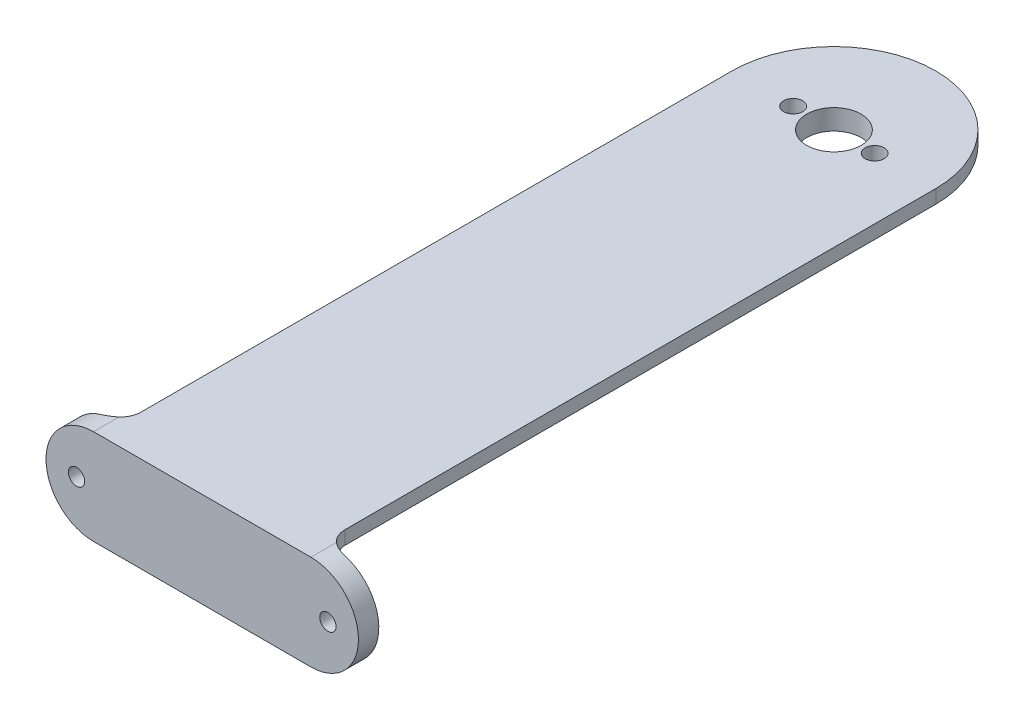
ISO-10303-21;
HEADER;
FILE_DESCRIPTION(('STEP AP214'),'2;1');
FILE_NAME('part.step','',(''),(''),'','','');
FILE_SCHEMA(('AUTOMOTIVE_DESIGN { 1 0 10303 214 1 1 1 1 }'));
ENDSEC;
DATA;
#1=APPLICATION_CONTEXT('core data for automotive mechanical design processes');
#2=APPLICATION_PROTOCOL_DEFINITION('international standard','automotive_design',2000,#1);
#3=PRODUCT_CONTEXT('',#1,'mechanical');
#4=PRODUCT('Part','Part','',(#3));
#5=PRODUCT_RELATED_PRODUCT_CATEGORY('part','',(#4));
#6=PRODUCT_DEFINITION_FORMATION('','',#4);
#7=PRODUCT_DEFINITION_CONTEXT('part definition',#1,'design');
#8=PRODUCT_DEFINITION('design','',#6,#7);
#9=PRODUCT_DEFINITION_SHAPE('','',#8);
#10=(LENGTH_UNIT() NAMED_UNIT(*) SI_UNIT(.MILLI.,.METRE.));
#11=(NAMED_UNIT(*) PLANE_ANGLE_UNIT() SI_UNIT($,.RADIAN.));
#12=(NAMED_UNIT(*) SI_UNIT($,.STERADIAN.) SOLID_ANGLE_UNIT());
#13=UNCERTAINTY_MEASURE_WITH_UNIT(LENGTH_MEASURE(1.E-05),#10,'distance_accuracy_value','');
#14=(GEOMETRIC_REPRESENTATION_CONTEXT(3) GLOBAL_UNCERTAINTY_ASSIGNED_CONTEXT((#13)) GLOBAL_UNIT_ASSIGNED_CONTEXT((#10,
#11,#12)) REPRESENTATION_CONTEXT('',''));
#15=CARTESIAN_POINT('',(0.,0.,0.));
#16=DIRECTION('',(0.,0.,1.));
#17=DIRECTION('',(1.,0.,0.));
#18=AXIS2_PLACEMENT_3D('',#15,#16,#17);
#19=CARTESIAN_POINT('',(0.,0.,0.));
#20=DIRECTION('',(0.,1.,0.));
#21=DIRECTION('',(0.,0.,1.));
#22=AXIS2_PLACEMENT_3D('',#19,#20,#21);
#23=PLANE('',#22);
#24=CARTESIAN_POINT('',(0.,0.,0.));
#25=DIRECTION('',(0.,1.,0.));
#26=DIRECTION('',(0.,0.,1.));
#27=AXIS2_PLACEMENT_3D('',#24,#25,#26);
#28=CIRCLE('',#27,7.75);
#29=CARTESIAN_POINT('',(0.,0.,7.75));
#30=VERTEX_POINT('',#29);
#31=EDGE_CURVE('E174',#30,#30,#28,.F.);
#32=ORIENTED_EDGE('',*,*,#31,.F.);
#33=EDGE_LOOP('',(#32));
#34=FACE_BOUND('',#33,.T.);
#35=DIRECTION('',(0.,0.,-1.));
#36=VECTOR('',#35,1.);
#37=CARTESIAN_POINT('',(15.,0.,90.));
#38=LINE('',#37,#36);
#39=CARTESIAN_POINT('',(15.,0.,87.));
#40=VERTEX_POINT('',#39);
#41=CARTESIAN_POINT('',(15.,0.,0.));
#42=VERTEX_POINT('',#41);
#43=EDGE_CURVE('E160',#40,#42,#38,.T.);
#44=ORIENTED_EDGE('',*,*,#43,.F.);
#45=DIRECTION('',(1.,0.,0.));
#46=VECTOR('',#45,1.);
#47=CARTESIAN_POINT('',(-15.,0.,87.));
#48=LINE('',#47,#46);
#49=CARTESIAN_POINT('',(-15.,0.,87.));
#50=VERTEX_POINT('',#49);
#51=EDGE_CURVE('E206',#40,#50,#48,.F.);
#52=ORIENTED_EDGE('',*,*,#51,.T.);
#53=DIRECTION('',(0.,0.,1.));
#54=VECTOR('',#53,1.);
#55=CARTESIAN_POINT('',(-15.,0.,0.));
#56=LINE('',#55,#54);
#57=CARTESIAN_POINT('',(-15.,0.,0.));
#58=VERTEX_POINT('',#57);
#59=EDGE_CURVE('E163',#58,#50,#56,.T.);
#60=ORIENTED_EDGE('',*,*,#59,.F.);
#61=CARTESIAN_POINT('',(0.,0.,0.));
#62=DIRECTION('',(0.,1.,0.));
#63=DIRECTION('',(0.,0.,1.));
#64=AXIS2_PLACEMENT_3D('',#61,#62,#63);
#65=CIRCLE('',#64,15.);
#66=EDGE_CURVE('E155',#42,#58,#65,.T.);
#67=ORIENTED_EDGE('',*,*,#66,.F.);
#68=EDGE_LOOP('',(#44,#52,#60,#67));
#69=FACE_BOUND('',#68,.T.);
#70=CARTESIAN_POINT('',(0.,0.,65.));
#71=DIRECTION('',(0.,1.,0.));
#72=DIRECTION('',(0.,0.,1.));
#73=AXIS2_PLACEMENT_3D('',#70,#71,#72);
#74=CIRCLE('',#73,3.75);
#75=CARTESIAN_POINT('',(0.,0.,68.75));
#76=VERTEX_POINT('',#75);
#77=EDGE_CURVE('E177',#76,#76,#74,.F.);
#78=ORIENTED_EDGE('',*,*,#77,.F.);
#79=EDGE_LOOP('',(#78));
#80=FACE_BOUND('',#79,.T.);
#81=ADVANCED_FACE('F32',(#34,#69,#80),#23,.F.);
#82=CARTESIAN_POINT('',(0.,2.,0.));
#83=DIRECTION('',(0.,1.,0.));
#84=DIRECTION('',(0.,0.,1.));
#85=AXIS2_PLACEMENT_3D('',#82,#83,#84);
#86=PLANE('',#85);
#87=CARTESIAN_POINT('',(-6.,2.,0.));
#88=DIRECTION('',(0.,1.,0.));
#89=DIRECTION('',(0.,0.,1.));
#90=AXIS2_PLACEMENT_3D('',#87,#88,#89);
#91=CIRCLE('',#90,1.4);
#92=CARTESIAN_POINT('',(-6.,2.,1.4));
#93=VERTEX_POINT('',#92);
#94=EDGE_CURVE('E134',#93,#93,#91,.T.);
#95=ORIENTED_EDGE('',*,*,#94,.F.);
#96=EDGE_LOOP('',(#95));
#97=FACE_BOUND('',#96,.T.);
#98=CARTESIAN_POINT('',(6.,2.,0.));
#99=DIRECTION('',(0.,1.,0.));
#100=DIRECTION('',(0.,0.,1.));
#101=AXIS2_PLACEMENT_3D('',#98,#99,#100);
#102=CIRCLE('',#101,1.4);
#103=CARTESIAN_POINT('',(6.,2.,1.4));
#104=VERTEX_POINT('',#103);
#105=EDGE_CURVE('E142',#104,#104,#102,.T.);
#106=ORIENTED_EDGE('',*,*,#105,.F.);
#107=EDGE_LOOP('',(#106));
#108=FACE_BOUND('',#107,.T.);
#109=CARTESIAN_POINT('',(0.,2.,0.));
#110=DIRECTION('',(0.,1.,0.));
#111=DIRECTION('',(0.,0.,1.));
#112=AXIS2_PLACEMENT_3D('',#109,#110,#111);
#113=CIRCLE('',#112,15.);
#114=CARTESIAN_POINT('',(15.,2.,0.));
#115=VERTEX_POINT('',#114);
#116=CARTESIAN_POINT('',(-15.,2.,0.));
#117=VERTEX_POINT('',#116);
#118=EDGE_CURVE('E156',#115,#117,#113,.T.);
#119=ORIENTED_EDGE('',*,*,#118,.T.);
#120=DIRECTION('',(0.,0.,1.));
#121=VECTOR('',#120,1.);
#122=CARTESIAN_POINT('',(-15.,2.,0.));
#123=LINE('',#122,#121);
#124=CARTESIAN_POINT('',(-15.,2.,87.));
#125=VERTEX_POINT('',#124);
#126=EDGE_CURVE('E159',#117,#125,#123,.T.);
#127=ORIENTED_EDGE('',*,*,#126,.T.);
#128=CARTESIAN_POINT('',(-18.,2.,87.));
#129=DIRECTION('',(0.,1.,0.));
#130=DIRECTION('',(0.,0.,1.));
#131=AXIS2_PLACEMENT_3D('',#128,#129,#130);
#132=CIRCLE('',#131,3.);
#133=CARTESIAN_POINT('',(-16.,2.,89.2360679774998));
#134=VERTEX_POINT('',#133);
#135=EDGE_CURVE('E42',#125,#134,#132,.F.);
#136=ORIENTED_EDGE('',*,*,#135,.T.);
#137=DIRECTION('',(0.,0.,-1.));
#138=VECTOR('',#137,1.);
#139=CARTESIAN_POINT('',(-16.,2.,93.));
#140=LINE('',#139,#138);
#141=CARTESIAN_POINT('',(-16.,2.,93.));
#142=VERTEX_POINT('',#141);
#143=EDGE_CURVE('E49',#142,#134,#140,.T.);
#144=ORIENTED_EDGE('',*,*,#143,.F.);
#145=DIRECTION('',(-1.,0.,0.));
#146=VECTOR('',#145,1.);
#147=CARTESIAN_POINT('',(-16.,2.,93.));
#148=LINE('',#147,#146);
#149=CARTESIAN_POINT('',(16.,2.,93.));
#150=VERTEX_POINT('',#149);
#151=EDGE_CURVE('E127',#150,#142,#148,.T.);
#152=ORIENTED_EDGE('',*,*,#151,.F.);
#153=DIRECTION('',(0.,0.,-1.));
#154=VECTOR('',#153,1.);
#155=CARTESIAN_POINT('',(16.,2.,93.));
#156=LINE('',#155,#154);
#157=CARTESIAN_POINT('',(16.,2.,89.2360679774998));
#158=VERTEX_POINT('',#157);
#159=EDGE_CURVE('E57',#150,#158,#156,.T.);
#160=ORIENTED_EDGE('',*,*,#159,.T.);
#161=CARTESIAN_POINT('',(18.,2.,87.));
#162=DIRECTION('',(0.,1.,0.));
#163=DIRECTION('',(0.,0.,1.));
#164=AXIS2_PLACEMENT_3D('',#161,#162,#163);
#165=CIRCLE('',#164,3.);
#166=CARTESIAN_POINT('',(15.,2.,87.));
#167=VERTEX_POINT('',#166);
#168=EDGE_CURVE('E217',#158,#167,#165,.F.);
#169=ORIENTED_EDGE('',*,*,#168,.T.);
#170=DIRECTION('',(0.,0.,-1.));
#171=VECTOR('',#170,1.);
#172=CARTESIAN_POINT('',(15.,2.,90.));
#173=LINE('',#172,#171);
#174=EDGE_CURVE('E171',#167,#115,#173,.T.);
#175=ORIENTED_EDGE('',*,*,#174,.T.);
#176=EDGE_LOOP('',(#119,#127,#136,#144,#152,#160,#169,#175));
#177=FACE_BOUND('',#176,.T.);
#178=CARTESIAN_POINT('',(0.,2.,0.));
#179=DIRECTION('',(0.,1.,0.));
#180=DIRECTION('',(0.,0.,1.));
#181=AXIS2_PLACEMENT_3D('',#178,#179,#180);
#182=CIRCLE('',#181,4.);
#183=CARTESIAN_POINT('',(0.,2.,4.));
#184=VERTEX_POINT('',#183);
#185=EDGE_CURVE('E152',#184,#184,#182,.T.);
#186=ORIENTED_EDGE('',*,*,#185,.F.);
#187=EDGE_LOOP('',(#186));
#188=FACE_BOUND('',#187,.T.);
#189=ADVANCED_FACE('F240',(#97,#108,#177,#188),#86,.T.);
#190=CARTESIAN_POINT('',(0.,2.,0.));
#191=DIRECTION('',(0.,-1.,0.));
#192=DIRECTION('',(0.,0.,-1.));
#193=AXIS2_PLACEMENT_3D('',#190,#191,#192);
#194=CYLINDRICAL_SURFACE('',#193,15.);
#195=ORIENTED_EDGE('',*,*,#66,.T.);
#196=DIRECTION('',(0.,-1.,0.));
#197=VECTOR('',#196,1.);
#198=CARTESIAN_POINT('',(-15.,2.,0.));
#199=LINE('',#198,#197);
#200=EDGE_CURVE('E170',#117,#58,#199,.T.);
#201=ORIENTED_EDGE('',*,*,#200,.F.);
#202=ORIENTED_EDGE('',*,*,#118,.F.);
#203=DIRECTION('',(0.,-1.,0.));
#204=VECTOR('',#203,1.);
#205=CARTESIAN_POINT('',(15.,2.,0.));
#206=LINE('',#205,#204);
#207=EDGE_CURVE('E167',#115,#42,#206,.T.);
#208=ORIENTED_EDGE('',*,*,#207,.T.);
#209=EDGE_LOOP('',(#195,#201,#202,#208));
#210=FACE_BOUND('',#209,.T.);
#211=ADVANCED_FACE('F246',(#210),#194,.T.);
#212=CARTESIAN_POINT('',(-15.,2.,0.));
#213=DIRECTION('',(1.,0.,0.));
#214=DIRECTION('',(0.,0.,-1.));
#215=AXIS2_PLACEMENT_3D('',#212,#213,#214);
#216=PLANE('',#215);
#217=ORIENTED_EDGE('',*,*,#59,.T.);
#218=DIRECTION('',(0.,-1.,0.));
#219=VECTOR('',#218,1.);
#220=CARTESIAN_POINT('',(-15.,2.,87.));
#221=LINE('',#220,#219);
#222=EDGE_CURVE('E208',#50,#125,#221,.F.);
#223=ORIENTED_EDGE('',*,*,#222,.T.);
#224=ORIENTED_EDGE('',*,*,#126,.F.);
#225=ORIENTED_EDGE('',*,*,#200,.T.);
#226=EDGE_LOOP('',(#217,#223,#224,#225));
#227=FACE_BOUND('',#226,.T.);
#228=ADVANCED_FACE('F257',(#227),#216,.F.);
#229=CARTESIAN_POINT('',(15.,2.,90.));
#230=DIRECTION('',(-1.,0.,0.));
#231=DIRECTION('',(0.,0.,1.));
#232=AXIS2_PLACEMENT_3D('',#229,#230,#231);
#233=PLANE('',#232);
#234=ORIENTED_EDGE('',*,*,#174,.F.);
#235=DIRECTION('',(0.,-1.,0.));
#236=VECTOR('',#235,1.);
#237=CARTESIAN_POINT('',(15.,0.,87.));
#238=LINE('',#237,#236);
#239=EDGE_CURVE('E186',#167,#40,#238,.T.);
#240=ORIENTED_EDGE('',*,*,#239,.T.);
#241=ORIENTED_EDGE('',*,*,#43,.T.);
#242=ORIENTED_EDGE('',*,*,#207,.F.);
#243=EDGE_LOOP('',(#234,#240,#241,#242));
#244=FACE_BOUND('',#243,.T.);
#245=ADVANCED_FACE('F253',(#244),#233,.F.);
#246=CARTESIAN_POINT('',(0.,2.,0.));
#247=DIRECTION('',(0.,-1.,0.));
#248=DIRECTION('',(0.,0.,-1.));
#249=AXIS2_PLACEMENT_3D('',#246,#247,#248);
#250=CYLINDRICAL_SURFACE('',#249,4.);
#251=ORIENTED_EDGE('',*,*,#185,.T.);
#252=EDGE_LOOP('',(#251));
#253=FACE_BOUND('',#252,.T.);
#254=CARTESIAN_POINT('',(0.,-1.,0.));
#255=DIRECTION('',(0.,-1.,0.));
#256=DIRECTION('',(0.,0.,-1.));
#257=AXIS2_PLACEMENT_3D('',#254,#255,#256);
#258=CIRCLE('',#257,4.);
#259=CARTESIAN_POINT('',(0.,-1.,-4.));
#260=VERTEX_POINT('',#259);
#261=EDGE_CURVE('E146',#260,#260,#258,.T.);
#262=ORIENTED_EDGE('',*,*,#261,.T.);
#263=EDGE_LOOP('',(#262));
#264=FACE_BOUND('',#263,.T.);
#265=ADVANCED_FACE('F256',(#253,#264),#250,.F.);
#266=CARTESIAN_POINT('',(0.,-1.,0.));
#267=DIRECTION('',(0.,-1.,0.));
#268=DIRECTION('',(0.,0.,-1.));
#269=AXIS2_PLACEMENT_3D('',#266,#267,#268);
#270=PLANE('',#269);
#271=CARTESIAN_POINT('',(-6.,-1.,0.));
#272=DIRECTION('',(0.,-1.,0.));
#273=DIRECTION('',(0.,0.,-1.));
#274=AXIS2_PLACEMENT_3D('',#271,#272,#273);
#275=CIRCLE('',#274,1.4);
#276=CARTESIAN_POINT('',(-6.,-1.,-1.4));
#277=VERTEX_POINT('',#276);
#278=EDGE_CURVE('E137',#277,#277,#275,.T.);
#279=ORIENTED_EDGE('',*,*,#278,.F.);
#280=EDGE_LOOP('',(#279));
#281=FACE_BOUND('',#280,.T.);
#282=CARTESIAN_POINT('',(6.,-1.,0.));
#283=DIRECTION('',(0.,-1.,0.));
#284=DIRECTION('',(0.,0.,-1.));
#285=AXIS2_PLACEMENT_3D('',#282,#283,#284);
#286=CIRCLE('',#285,1.4);
#287=CARTESIAN_POINT('',(6.,-1.,-1.4));
#288=VERTEX_POINT('',#287);
#289=EDGE_CURVE('E145',#288,#288,#286,.T.);
#290=ORIENTED_EDGE('',*,*,#289,.F.);
#291=EDGE_LOOP('',(#290));
#292=FACE_BOUND('',#291,.T.);
#293=CARTESIAN_POINT('',(0.,-1.,0.));
#294=DIRECTION('',(0.,-1.,0.));
#295=DIRECTION('',(0.,0.,-1.));
#296=AXIS2_PLACEMENT_3D('',#293,#294,#295);
#297=CIRCLE('',#296,7.75);
#298=CARTESIAN_POINT('',(0.,-1.,-7.75));
#299=VERTEX_POINT('',#298);
#300=EDGE_CURVE('E149',#299,#299,#297,.T.);
#301=ORIENTED_EDGE('',*,*,#300,.T.);
#302=EDGE_LOOP('',(#301));
#303=FACE_BOUND('',#302,.T.);
#304=ORIENTED_EDGE('',*,*,#261,.F.);
#305=EDGE_LOOP('',(#304));
#306=FACE_BOUND('',#305,.T.);
#307=ADVANCED_FACE('F337',(#281,#292,#303,#306),#270,.T.);
#308=CARTESIAN_POINT('',(0.,-1.,0.));
#309=DIRECTION('',(0.,1.,0.));
#310=DIRECTION('',(0.,0.,1.));
#311=AXIS2_PLACEMENT_3D('',#308,#309,#310);
#312=CYLINDRICAL_SURFACE('',#311,7.75);
#313=ORIENTED_EDGE('',*,*,#300,.F.);
#314=EDGE_LOOP('',(#313));
#315=FACE_BOUND('',#314,.T.);
#316=ORIENTED_EDGE('',*,*,#31,.T.);
#317=EDGE_LOOP('',(#316));
#318=FACE_BOUND('',#317,.T.);
#319=ADVANCED_FACE('F335',(#315,#318),#312,.T.);
#320=CARTESIAN_POINT('',(0.,-3.,65.));
#321=DIRECTION('',(0.,1.,0.));
#322=DIRECTION('',(0.,0.,1.));
#323=AXIS2_PLACEMENT_3D('',#320,#321,#322);
#324=CYLINDRICAL_SURFACE('',#323,3.75);
#325=CARTESIAN_POINT('',(0.,-2.,65.));
#326=DIRECTION('',(0.,-1.,0.));
#327=DIRECTION('',(0.,0.,-1.));
#328=AXIS2_PLACEMENT_3D('',#325,#326,#327);
#329=CIRCLE('',#328,3.75);
#330=CARTESIAN_POINT('',(0.,-2.,61.25));
#331=VERTEX_POINT('',#330);
#332=EDGE_CURVE('E183',#331,#331,#329,.F.);
#333=ORIENTED_EDGE('',*,*,#332,.T.);
#334=EDGE_LOOP('',(#333));
#335=FACE_BOUND('',#334,.T.);
#336=ORIENTED_EDGE('',*,*,#77,.T.);
#337=EDGE_LOOP('',(#336));
#338=FACE_BOUND('',#337,.T.);
#339=ADVANCED_FACE('F331',(#335,#338),#324,.T.);
#340=CARTESIAN_POINT('',(0.,-3.,65.));
#341=DIRECTION('',(0.,-1.,0.));
#342=DIRECTION('',(0.,0.,-1.));
#343=AXIS2_PLACEMENT_3D('',#340,#341,#342);
#344=PLANE('',#343);
#345=CARTESIAN_POINT('',(0.,-3.,65.));
#346=DIRECTION('',(0.,-1.,0.));
#347=DIRECTION('',(0.,0.,-1.));
#348=AXIS2_PLACEMENT_3D('',#345,#346,#347);
#349=CIRCLE('',#348,2.75);
#350=CARTESIAN_POINT('',(0.,-3.,62.25));
#351=VERTEX_POINT('',#350);
#352=EDGE_CURVE('E180',#351,#351,#349,.T.);
#353=ORIENTED_EDGE('',*,*,#352,.T.);
#354=EDGE_LOOP('',(#353));
#355=FACE_BOUND('',#354,.T.);
#356=ADVANCED_FACE('F328',(#355),#344,.T.);
#357=CARTESIAN_POINT('',(0.,-2.,65.));
#358=DIRECTION('',(0.,-1.,0.));
#359=DIRECTION('',(0.,0.,-1.));
#360=AXIS2_PLACEMENT_3D('',#357,#358,#359);
#361=TOROIDAL_SURFACE('',#360,2.75,1.);
#362=ORIENTED_EDGE('',*,*,#332,.F.);
#363=EDGE_LOOP('',(#362));
#364=FACE_BOUND('',#363,.T.);
#365=ORIENTED_EDGE('',*,*,#352,.F.);
#366=EDGE_LOOP('',(#365));
#367=FACE_BOUND('',#366,.T.);
#368=ADVANCED_FACE('F229',(#364,#367),#361,.T.);
#369=CARTESIAN_POINT('',(6.,-3.,0.));
#370=DIRECTION('',(0.,1.,0.));
#371=DIRECTION('',(0.,0.,1.));
#372=AXIS2_PLACEMENT_3D('',#369,#370,#371);
#373=CYLINDRICAL_SURFACE('',#372,1.4);
#374=ORIENTED_EDGE('',*,*,#289,.T.);
#375=EDGE_LOOP('',(#374));
#376=FACE_BOUND('',#375,.T.);
#377=ORIENTED_EDGE('',*,*,#105,.T.);
#378=EDGE_LOOP('',(#377));
#379=FACE_BOUND('',#378,.T.);
#380=ADVANCED_FACE('F323',(#376,#379),#373,.F.);
#381=CARTESIAN_POINT('',(-6.,-3.,0.));
#382=DIRECTION('',(0.,1.,0.));
#383=DIRECTION('',(0.,0.,1.));
#384=AXIS2_PLACEMENT_3D('',#381,#382,#383);
#385=CYLINDRICAL_SURFACE('',#384,1.4);
#386=ORIENTED_EDGE('',*,*,#278,.T.);
#387=EDGE_LOOP('',(#386));
#388=FACE_BOUND('',#387,.T.);
#389=ORIENTED_EDGE('',*,*,#94,.T.);
#390=EDGE_LOOP('',(#389));
#391=FACE_BOUND('',#390,.T.);
#392=ADVANCED_FACE('F320',(#388,#391),#385,.F.);
#393=CARTESIAN_POINT('',(-16.,-5.,93.));
#394=DIRECTION('',(0.,0.,1.));
#395=DIRECTION('',(1.,0.,0.));
#396=AXIS2_PLACEMENT_3D('',#393,#394,#395);
#397=PLANE('',#396);
#398=CARTESIAN_POINT('',(-18.5,-5.,93.));
#399=DIRECTION('',(0.,0.,1.));
#400=DIRECTION('',(1.,0.,0.));
#401=AXIS2_PLACEMENT_3D('',#398,#399,#400);
#402=CIRCLE('',#401,1.2);
#403=CARTESIAN_POINT('',(-17.3,-5.,93.));
#404=VERTEX_POINT('',#403);
#405=EDGE_CURVE('E295',#404,#404,#402,.T.);
#406=ORIENTED_EDGE('',*,*,#405,.F.);
#407=EDGE_LOOP('',(#406));
#408=FACE_BOUND('',#407,.T.);
#409=CARTESIAN_POINT('',(-16.,-5.,93.));
#410=DIRECTION('',(0.,0.,1.));
#411=DIRECTION('',(1.,0.,0.));
#412=AXIS2_PLACEMENT_3D('',#409,#410,#411);
#413=CIRCLE('',#412,7.);
#414=CARTESIAN_POINT('',(-16.,-12.,93.));
#415=VERTEX_POINT('',#414);
#416=EDGE_CURVE('E123',#142,#415,#413,.T.);
#417=ORIENTED_EDGE('',*,*,#416,.T.);
#418=DIRECTION('',(1.,0.,0.));
#419=VECTOR('',#418,1.);
#420=CARTESIAN_POINT('',(-16.,-12.,93.));
#421=LINE('',#420,#419);
#422=CARTESIAN_POINT('',(16.,-12.,93.));
#423=VERTEX_POINT('',#422);
#424=EDGE_CURVE('E113',#415,#423,#421,.T.);
#425=ORIENTED_EDGE('',*,*,#424,.T.);
#426=CARTESIAN_POINT('',(16.,-4.99999999999999,93.));
#427=DIRECTION('',(0.,0.,1.));
#428=DIRECTION('',(1.,0.,0.));
#429=AXIS2_PLACEMENT_3D('',#426,#427,#428);
#430=CIRCLE('',#429,7.);
#431=EDGE_CURVE('E122',#423,#150,#430,.T.);
#432=ORIENTED_EDGE('',*,*,#431,.T.);
#433=ORIENTED_EDGE('',*,*,#151,.T.);
#434=EDGE_LOOP('',(#417,#425,#432,#433));
#435=FACE_BOUND('',#434,.T.);
#436=CARTESIAN_POINT('',(18.5,-4.99999999999999,93.));
#437=DIRECTION('',(0.,0.,1.));
#438=DIRECTION('',(-1.,0.,0.));
#439=AXIS2_PLACEMENT_3D('',#436,#437,#438);
#440=CIRCLE('',#439,1.2);
#441=CARTESIAN_POINT('',(17.3,-4.99999999999999,93.));
#442=VERTEX_POINT('',#441);
#443=EDGE_CURVE('E287',#442,#442,#440,.T.);
#444=ORIENTED_EDGE('',*,*,#443,.F.);
#445=EDGE_LOOP('',(#444));
#446=FACE_BOUND('',#445,.T.);
#447=ADVANCED_FACE('F125',(#408,#435,#446),#397,.T.);
#448=CARTESIAN_POINT('',(-16.,-5.,90.));
#449=DIRECTION('',(0.,0.,1.));
#450=DIRECTION('',(1.,0.,0.));
#451=AXIS2_PLACEMENT_3D('',#448,#449,#450);
#452=PLANE('',#451);
#453=DIRECTION('',(1.,0.,0.));
#454=VECTOR('',#453,1.);
#455=CARTESIAN_POINT('',(15.,-3.,90.));
#456=LINE('',#455,#454);
#457=CARTESIAN_POINT('',(-18.,-3.,90.));
#458=VERTEX_POINT('',#457);
#459=CARTESIAN_POINT('',(18.,-3.,90.));
#460=VERTEX_POINT('',#459);
#461=EDGE_CURVE('E202',#458,#460,#456,.T.);
#462=ORIENTED_EDGE('',*,*,#461,.T.);
#463=DIRECTION('',(0.,-1.,0.));
#464=VECTOR('',#463,1.);
#465=CARTESIAN_POINT('',(18.,2.,90.));
#466=LINE('',#465,#464);
#467=CARTESIAN_POINT('',(18.,1.70820393249938,90.));
#468=VERTEX_POINT('',#467);
#469=EDGE_CURVE('E204',#460,#468,#466,.F.);
#470=ORIENTED_EDGE('',*,*,#469,.T.);
#471=CARTESIAN_POINT('',(16.,-4.99999999999999,90.));
#472=DIRECTION('',(0.,0.,1.));
#473=DIRECTION('',(1.,0.,0.));
#474=AXIS2_PLACEMENT_3D('',#471,#472,#473);
#475=CIRCLE('',#474,7.);
#476=CARTESIAN_POINT('',(16.,-12.,90.));
#477=VERTEX_POINT('',#476);
#478=EDGE_CURVE('E128',#477,#468,#475,.T.);
#479=ORIENTED_EDGE('',*,*,#478,.F.);
#480=DIRECTION('',(1.,0.,0.));
#481=VECTOR('',#480,1.);
#482=CARTESIAN_POINT('',(-16.,-12.,90.));
#483=LINE('',#482,#481);
#484=CARTESIAN_POINT('',(-16.,-12.,90.));
#485=VERTEX_POINT('',#484);
#486=EDGE_CURVE('E303',#485,#477,#483,.T.);
#487=ORIENTED_EDGE('',*,*,#486,.F.);
#488=CARTESIAN_POINT('',(-16.,-5.,90.));
#489=DIRECTION('',(0.,0.,1.));
#490=DIRECTION('',(1.,0.,0.));
#491=AXIS2_PLACEMENT_3D('',#488,#489,#490);
#492=CIRCLE('',#491,7.);
#493=CARTESIAN_POINT('',(-18.,1.70820393249937,90.));
#494=VERTEX_POINT('',#493);
#495=EDGE_CURVE('E132',#494,#485,#492,.T.);
#496=ORIENTED_EDGE('',*,*,#495,.F.);
#497=DIRECTION('',(0.,-1.,0.));
#498=VECTOR('',#497,1.);
#499=CARTESIAN_POINT('',(-18.,0.,90.));
#500=LINE('',#499,#498);
#501=EDGE_CURVE('E200',#494,#458,#500,.T.);
#502=ORIENTED_EDGE('',*,*,#501,.T.);
#503=EDGE_LOOP('',(#462,#470,#479,#487,#496,#502));
#504=FACE_BOUND('',#503,.T.);
#505=CARTESIAN_POINT('',(-18.5,-5.,90.));
#506=DIRECTION('',(0.,0.,1.));
#507=DIRECTION('',(1.,0.,0.));
#508=AXIS2_PLACEMENT_3D('',#505,#506,#507);
#509=CIRCLE('',#508,1.2);
#510=CARTESIAN_POINT('',(-17.3,-5.,90.));
#511=VERTEX_POINT('',#510);
#512=EDGE_CURVE('E292',#511,#511,#509,.T.);
#513=ORIENTED_EDGE('',*,*,#512,.T.);
#514=EDGE_LOOP('',(#513));
#515=FACE_BOUND('',#514,.T.);
#516=CARTESIAN_POINT('',(18.5,-4.99999999999999,90.));
#517=DIRECTION('',(0.,0.,1.));
#518=DIRECTION('',(-1.,0.,0.));
#519=AXIS2_PLACEMENT_3D('',#516,#517,#518);
#520=CIRCLE('',#519,1.2);
#521=CARTESIAN_POINT('',(17.3,-4.99999999999999,90.));
#522=VERTEX_POINT('',#521);
#523=EDGE_CURVE('E285',#522,#522,#520,.T.);
#524=ORIENTED_EDGE('',*,*,#523,.T.);
#525=EDGE_LOOP('',(#524));
#526=FACE_BOUND('',#525,.T.);
#527=ADVANCED_FACE('F310',(#504,#515,#526),#452,.F.);
#528=CARTESIAN_POINT('',(-16.,-5.,93.));
#529=DIRECTION('',(0.,0.,-1.));
#530=DIRECTION('',(-1.,0.,0.));
#531=AXIS2_PLACEMENT_3D('',#528,#529,#530);
#532=CYLINDRICAL_SURFACE('',#531,7.);
#533=ORIENTED_EDGE('',*,*,#143,.T.);
#534=CARTESIAN_POINT('',(-16.,2.,89.2360679774998));
#535=CARTESIAN_POINT('',(-16.0595004904157,2.0000042023315,89.2892994395713));
#536=CARTESIAN_POINT('',(-16.1211406261996,1.99924148467206,89.3401438049665));
#537=CARTESIAN_POINT('',(-16.2482527737459,1.99588439976752,89.436748041305));
#538=CARTESIAN_POINT('',(-16.3137254391384,1.99328971924527,89.4825070410696));
#539=CARTESIAN_POINT('',(-16.4480428858382,1.98597024037812,89.5686171525142));
#540=CARTESIAN_POINT('',(-16.5168880840742,1.98124517806989,89.6089675932468));
#541=CARTESIAN_POINT('',(-16.6573852379739,1.96942083338846,89.683977592512));
#542=CARTESIAN_POINT('',(-16.7290368693657,1.9623218246049,89.7186378061388));
#543=CARTESIAN_POINT('',(-16.9476394598505,1.93710469030663,89.8138517200919));
#544=CARTESIAN_POINT('',(-17.0981186834371,1.91507205130711,89.8655624590864));
#545=CARTESIAN_POINT('',(-17.4030821606984,1.85968727554391,89.9442224899886));
#546=CARTESIAN_POINT('',(-17.5575580984841,1.82635713128476,89.9712195162839));
#547=CARTESIAN_POINT('',(-17.7598418373481,1.77535701758111,89.9907672599656));
#548=CARTESIAN_POINT('',(-17.8080466684524,1.76265248816576,89.994241429558));
#549=CARTESIAN_POINT('',(-17.904212466519,1.73620420972152,89.9988550342161));
#550=CARTESIAN_POINT('',(-17.9521736757935,1.72246189578489,89.9999976343166));
#551=CARTESIAN_POINT('',(-18.,1.70820393249937,90.));
#552=B_SPLINE_CURVE_WITH_KNOTS('',3,(#534,#535,#536,#537,#538,#539,#540,#541,#542,#543,#544,
#545,#546,#547,#548,#549,#550,#551),.UNSPECIFIED.,.F.,.F.,(4,2,2,2,2,2,2,2,4),(0.,
0.23944640605455,0.478933768867631,0.718450813337324,0.957940263751337,1.43733899215176,
1.91580979896587,2.06567938837238,2.21534539865473),.UNSPECIFIED.);
#553=EDGE_CURVE('E11',#134,#494,#552,.T.);
#554=ORIENTED_EDGE('',*,*,#553,.T.);
#555=ORIENTED_EDGE('',*,*,#495,.T.);
#556=DIRECTION('',(0.,0.,-1.));
#557=VECTOR('',#556,1.);
#558=CARTESIAN_POINT('',(-16.,-12.,93.));
#559=LINE('',#558,#557);
#560=EDGE_CURVE('E117',#415,#485,#559,.T.);
#561=ORIENTED_EDGE('',*,*,#560,.F.);
#562=ORIENTED_EDGE('',*,*,#416,.F.);
#563=EDGE_LOOP('',(#533,#554,#555,#561,#562));
#564=FACE_BOUND('',#563,.T.);
#565=ADVANCED_FACE('F130',(#564),#532,.T.);
#566=CARTESIAN_POINT('',(-16.,-12.,93.));
#567=DIRECTION('',(0.,1.,0.));
#568=DIRECTION('',(-1.,0.,0.));
#569=AXIS2_PLACEMENT_3D('',#566,#567,#568);
#570=PLANE('',#569);
#571=ORIENTED_EDGE('',*,*,#486,.T.);
#572=DIRECTION('',(0.,0.,-1.));
#573=VECTOR('',#572,1.);
#574=CARTESIAN_POINT('',(16.,-12.,93.));
#575=LINE('',#574,#573);
#576=EDGE_CURVE('E119',#423,#477,#575,.T.);
#577=ORIENTED_EDGE('',*,*,#576,.F.);
#578=ORIENTED_EDGE('',*,*,#424,.F.);
#579=ORIENTED_EDGE('',*,*,#560,.T.);
#580=EDGE_LOOP('',(#571,#577,#578,#579));
#581=FACE_BOUND('',#580,.T.);
#582=ADVANCED_FACE('F115',(#581),#570,.F.);
#583=CARTESIAN_POINT('',(16.,-4.99999999999999,93.));
#584=DIRECTION('',(0.,0.,-1.));
#585=DIRECTION('',(-1.,0.,0.));
#586=AXIS2_PLACEMENT_3D('',#583,#584,#585);
#587=CYLINDRICAL_SURFACE('',#586,7.);
#588=ORIENTED_EDGE('',*,*,#478,.T.);
#589=CARTESIAN_POINT('',(18.,1.70820393249938,90.));
#590=CARTESIAN_POINT('',(17.9234907979112,1.73102666557484,90.0000101963084));
#591=CARTESIAN_POINT('',(17.8465769663021,1.75252069862392,89.9970730313139));
#592=CARTESIAN_POINT('',(17.692482087082,1.7927759389242,89.985195220742));
#593=CARTESIAN_POINT('',(17.6153009860865,1.81153656361105,89.9762532976569));
#594=CARTESIAN_POINT('',(17.4612489636071,1.8462392584856,89.9522574769464));
#595=CARTESIAN_POINT('',(17.3843780328819,1.8621814132624,89.9372037627955));
#596=CARTESIAN_POINT('',(17.2315794903982,1.89124602259657,89.9009831492896));
#597=CARTESIAN_POINT('',(17.1556517545079,1.9043688519838,89.8798170634539));
#598=CARTESIAN_POINT('',(16.9299119252242,1.93962421360642,89.8071101543315));
#599=CARTESIAN_POINT('',(16.7822899291572,1.95761119916839,89.7463832134327));
#600=CARTESIAN_POINT('',(16.4981923815309,1.98370742259801,89.6019084397148));
#601=CARTESIAN_POINT('',(16.3616961493097,1.99183539599671,89.5182046434289));
#602=CARTESIAN_POINT('',(16.1924375170302,1.99747191833019,89.3948334445092));
#603=CARTESIAN_POINT('',(16.152819490154,1.99843994185831,89.3644080723883));
#604=CARTESIAN_POINT('',(16.0751978686107,1.99970308299035,89.3016552553661));
#605=CARTESIAN_POINT('',(16.0371921373396,1.9999991202984,89.2693304723432));
#606=CARTESIAN_POINT('',(16.,2.00000000000001,89.2360679774998));
#607=B_SPLINE_CURVE_WITH_KNOTS('',3,(#589,#590,#591,#592,#593,#594,#595,#596,#597,#598,#599,
#600,#601,#602,#603,#604,#605,#606),.UNSPECIFIED.,.F.,.F.,(4,2,2,2,2,2,2,2,4),(0.,
0.239466607156666,0.478984176797078,0.718494556714257,0.957973073947685,1.43737991455247,
1.91587428190541,2.06571425394936,2.21534902573224),.UNSPECIFIED.);
#608=EDGE_CURVE('E210',#468,#158,#607,.T.);
#609=ORIENTED_EDGE('',*,*,#608,.T.);
#610=ORIENTED_EDGE('',*,*,#159,.F.);
#611=ORIENTED_EDGE('',*,*,#431,.F.);
#612=ORIENTED_EDGE('',*,*,#576,.T.);
#613=EDGE_LOOP('',(#588,#609,#610,#611,#612));
#614=FACE_BOUND('',#613,.T.);
#615=ADVANCED_FACE('F219',(#614),#587,.T.);
#616=CARTESIAN_POINT('',(-18.5,-5.,93.));
#617=DIRECTION('',(0.,0.,-1.));
#618=DIRECTION('',(-1.,0.,0.));
#619=AXIS2_PLACEMENT_3D('',#616,#617,#618);
#620=CYLINDRICAL_SURFACE('',#619,1.2);
#621=ORIENTED_EDGE('',*,*,#405,.T.);
#622=EDGE_LOOP('',(#621));
#623=FACE_BOUND('',#622,.T.);
#624=ORIENTED_EDGE('',*,*,#512,.F.);
#625=EDGE_LOOP('',(#624));
#626=FACE_BOUND('',#625,.T.);
#627=ADVANCED_FACE('F411',(#623,#626),#620,.F.);
#628=CARTESIAN_POINT('',(18.5,-4.99999999999999,93.));
#629=DIRECTION('',(0.,0.,-1.));
#630=DIRECTION('',(-1.,0.,0.));
#631=AXIS2_PLACEMENT_3D('',#628,#629,#630);
#632=CYLINDRICAL_SURFACE('',#631,1.2);
#633=ORIENTED_EDGE('',*,*,#443,.T.);
#634=EDGE_LOOP('',(#633));
#635=FACE_BOUND('',#634,.T.);
#636=ORIENTED_EDGE('',*,*,#523,.F.);
#637=EDGE_LOOP('',(#636));
#638=FACE_BOUND('',#637,.T.);
#639=ADVANCED_FACE('F236',(#635,#638),#632,.F.);
#640=CARTESIAN_POINT('',(-18.,-5.,87.));
#641=DIRECTION('',(0.,1.,0.));
#642=DIRECTION('',(0.,0.,1.));
#643=AXIS2_PLACEMENT_3D('',#640,#641,#642);
#644=CYLINDRICAL_SURFACE('',#643,3.);
#645=ORIENTED_EDGE('',*,*,#135,.F.);
#646=ORIENTED_EDGE('',*,*,#222,.F.);
#647=CARTESIAN_POINT('',(-18.,-3.,87.));
#648=DIRECTION('',(-0.707106781186547,0.707106781186547,0.));
#649=DIRECTION('',(0.707106781186547,0.707106781186547,0.));
#650=AXIS2_PLACEMENT_3D('',#647,#648,#649);
#651=ELLIPSE('',#650,4.24264068711928,3.);
#652=EDGE_CURVE('E37',#458,#50,#651,.T.);
#653=ORIENTED_EDGE('',*,*,#652,.F.);
#654=ORIENTED_EDGE('',*,*,#501,.F.);
#655=ORIENTED_EDGE('',*,*,#553,.F.);
#656=EDGE_LOOP('',(#645,#646,#653,#654,#655));
#657=FACE_BOUND('',#656,.T.);
#658=ADVANCED_FACE('F34',(#657),#644,.F.);
#659=CARTESIAN_POINT('',(-16.,-3.,87.));
#660=DIRECTION('',(-1.,0.,0.));
#661=DIRECTION('',(0.,0.,1.));
#662=AXIS2_PLACEMENT_3D('',#659,#660,#661);
#663=CYLINDRICAL_SURFACE('',#662,3.);
#664=ORIENTED_EDGE('',*,*,#652,.T.);
#665=ORIENTED_EDGE('',*,*,#51,.F.);
#666=CARTESIAN_POINT('',(18.,-3.,87.));
#667=DIRECTION('',(-0.707106781186547,-0.707106781186547,0.));
#668=DIRECTION('',(-0.707106781186547,0.707106781186547,0.));
#669=AXIS2_PLACEMENT_3D('',#666,#667,#668);
#670=ELLIPSE('',#669,4.24264068711928,3.);
#671=EDGE_CURVE('E281',#460,#40,#670,.T.);
#672=ORIENTED_EDGE('',*,*,#671,.F.);
#673=ORIENTED_EDGE('',*,*,#461,.F.);
#674=EDGE_LOOP('',(#664,#665,#672,#673));
#675=FACE_BOUND('',#674,.T.);
#676=ADVANCED_FACE('F227',(#675),#663,.F.);
#677=CARTESIAN_POINT('',(18.,2.,87.));
#678=DIRECTION('',(0.,1.,0.));
#679=DIRECTION('',(0.,0.,1.));
#680=AXIS2_PLACEMENT_3D('',#677,#678,#679);
#681=CYLINDRICAL_SURFACE('',#680,3.);
#682=ORIENTED_EDGE('',*,*,#608,.F.);
#683=ORIENTED_EDGE('',*,*,#469,.F.);
#684=ORIENTED_EDGE('',*,*,#671,.T.);
#685=ORIENTED_EDGE('',*,*,#239,.F.);
#686=ORIENTED_EDGE('',*,*,#168,.F.);
#687=EDGE_LOOP('',(#682,#683,#684,#685,#686));
#688=FACE_BOUND('',#687,.T.);
#689=ADVANCED_FACE('F223',(#688),#681,.F.);
#690=CLOSED_SHELL('',(#81,#189,#211,#228,#245,#265,#307,#319,#339,#356,#368,#380,#392,#447,#527,
#565,#582,#615,#627,#639,#658,#676,#689));
#691=MANIFOLD_SOLID_BREP('B2',#690);
#692=ADVANCED_BREP_SHAPE_REPRESENTATION('',(#18,#691),#14);
#693=SHAPE_DEFINITION_REPRESENTATION(#9,#692);
ENDSEC;
END-ISO-10303-21;
